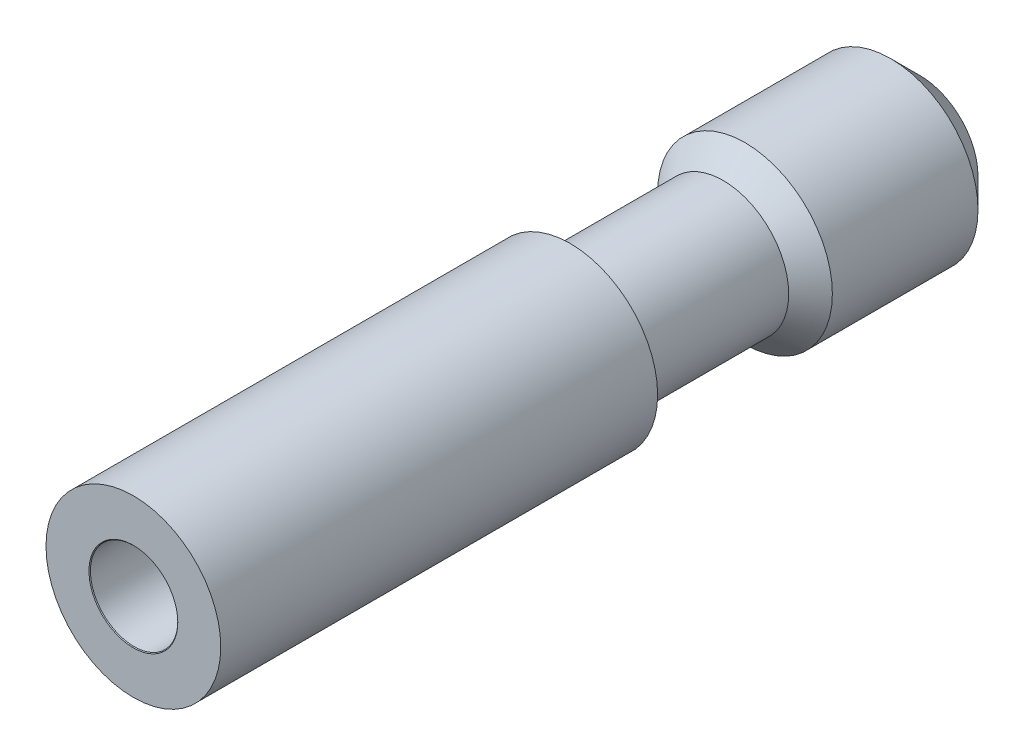
ISO-10303-21;
HEADER;
FILE_DESCRIPTION(('STEP AP214'),'2;1');
FILE_NAME('part.step','',(''),(''),'','','');
FILE_SCHEMA(('AUTOMOTIVE_DESIGN { 1 0 10303 214 1 1 1 1 }'));
ENDSEC;
DATA;
#1=APPLICATION_CONTEXT('core data for automotive mechanical design processes');
#2=APPLICATION_PROTOCOL_DEFINITION('international standard','automotive_design',2000,#1);
#3=PRODUCT_CONTEXT('',#1,'mechanical');
#4=PRODUCT('Part','Part','',(#3));
#5=PRODUCT_RELATED_PRODUCT_CATEGORY('part','',(#4));
#6=PRODUCT_DEFINITION_FORMATION('','',#4);
#7=PRODUCT_DEFINITION_CONTEXT('part definition',#1,'design');
#8=PRODUCT_DEFINITION('design','',#6,#7);
#9=PRODUCT_DEFINITION_SHAPE('','',#8);
#10=(LENGTH_UNIT() NAMED_UNIT(*) SI_UNIT(.MILLI.,.METRE.));
#11=(NAMED_UNIT(*) PLANE_ANGLE_UNIT() SI_UNIT($,.RADIAN.));
#12=(NAMED_UNIT(*) SI_UNIT($,.STERADIAN.) SOLID_ANGLE_UNIT());
#13=UNCERTAINTY_MEASURE_WITH_UNIT(LENGTH_MEASURE(1.E-05),#10,'distance_accuracy_value','');
#14=(GEOMETRIC_REPRESENTATION_CONTEXT(3) GLOBAL_UNCERTAINTY_ASSIGNED_CONTEXT((#13)) GLOBAL_UNIT_ASSIGNED_CONTEXT((#10,
#11,#12)) REPRESENTATION_CONTEXT('',''));
#15=CARTESIAN_POINT('',(0.,0.,0.));
#16=DIRECTION('',(0.,0.,1.));
#17=DIRECTION('',(1.,0.,0.));
#18=AXIS2_PLACEMENT_3D('',#15,#16,#17);
#19=CARTESIAN_POINT('',(0.,0.,27.));
#20=DIRECTION('',(0.,0.,-1.));
#21=DIRECTION('',(-1.,0.,0.));
#22=AXIS2_PLACEMENT_3D('',#19,#20,#21);
#23=CYLINDRICAL_SURFACE('',#22,3.);
#24=CARTESIAN_POINT('',(0.,0.,1.));
#25=DIRECTION('',(0.,0.,1.));
#26=DIRECTION('',(1.,0.,0.));
#27=AXIS2_PLACEMENT_3D('',#24,#25,#26);
#28=CIRCLE('',#27,3.);
#29=CARTESIAN_POINT('',(3.,0.,1.));
#30=VERTEX_POINT('',#29);
#31=EDGE_CURVE('E44',#30,#30,#28,.T.);
#32=ORIENTED_EDGE('',*,*,#31,.T.);
#33=EDGE_LOOP('',(#32));
#34=FACE_BOUND('',#33,.T.);
#35=CARTESIAN_POINT('',(0.,0.,6.));
#36=DIRECTION('',(0.,0.,1.));
#37=DIRECTION('',(1.,0.,0.));
#38=AXIS2_PLACEMENT_3D('',#35,#36,#37);
#39=CIRCLE('',#38,3.);
#40=CARTESIAN_POINT('',(3.,0.,6.));
#41=VERTEX_POINT('',#40);
#42=EDGE_CURVE('E51',#41,#41,#39,.T.);
#43=ORIENTED_EDGE('',*,*,#42,.F.);
#44=EDGE_LOOP('',(#43));
#45=FACE_BOUND('',#44,.T.);
#46=ADVANCED_FACE('F33',(#34,#45),#23,.T.);
#47=CARTESIAN_POINT('',(0.,0.,12.));
#48=DIRECTION('',(0.,0.,1.));
#49=DIRECTION('',(1.,0.,0.));
#50=AXIS2_PLACEMENT_3D('',#47,#48,#49);
#51=CIRCLE('',#50,3.);
#52=CARTESIAN_POINT('',(3.,0.,12.));
#53=VERTEX_POINT('',#52);
#54=EDGE_CURVE('E55',#53,#53,#51,.T.);
#55=ORIENTED_EDGE('',*,*,#54,.T.);
#56=EDGE_LOOP('',(#55));
#57=FACE_BOUND('',#56,.T.);
#58=CARTESIAN_POINT('',(0.,0.,27.));
#59=DIRECTION('',(0.,0.,1.));
#60=DIRECTION('',(1.,0.,0.));
#61=AXIS2_PLACEMENT_3D('',#58,#59,#60);
#62=CIRCLE('',#61,3.);
#63=CARTESIAN_POINT('',(3.,0.,27.));
#64=VERTEX_POINT('',#63);
#65=EDGE_CURVE('E48',#64,#64,#62,.T.);
#66=ORIENTED_EDGE('',*,*,#65,.F.);
#67=EDGE_LOOP('',(#66));
#68=FACE_BOUND('',#67,.T.);
#69=ADVANCED_FACE('F93',(#57,#68),#23,.T.);
#70=CARTESIAN_POINT('',(0.,0.,27.));
#71=DIRECTION('',(0.,0.,1.));
#72=DIRECTION('',(1.,0.,0.));
#73=AXIS2_PLACEMENT_3D('',#70,#71,#72);
#74=PLANE('',#73);
#75=CARTESIAN_POINT('',(0.,0.,27.));
#76=DIRECTION('',(0.,0.,1.));
#77=DIRECTION('',(1.,0.,0.));
#78=AXIS2_PLACEMENT_3D('',#75,#76,#77);
#79=CIRCLE('',#78,1.525);
#80=CARTESIAN_POINT('',(1.525,0.,27.));
#81=VERTEX_POINT('',#80);
#82=EDGE_CURVE('E62',#81,#81,#79,.T.);
#83=ORIENTED_EDGE('',*,*,#82,.F.);
#84=EDGE_LOOP('',(#83));
#85=FACE_BOUND('',#84,.T.);
#86=ORIENTED_EDGE('',*,*,#65,.T.);
#87=EDGE_LOOP('',(#86));
#88=FACE_BOUND('',#87,.T.);
#89=ADVANCED_FACE('F99',(#85,#88),#74,.T.);
#90=CARTESIAN_POINT('',(0.,0.,0.));
#91=DIRECTION('',(0.,0.,1.));
#92=DIRECTION('',(1.,0.,0.));
#93=AXIS2_PLACEMENT_3D('',#90,#91,#92);
#94=PLANE('',#93);
#95=CARTESIAN_POINT('',(0.,0.,0.));
#96=DIRECTION('',(0.,0.,1.));
#97=DIRECTION('',(1.,0.,0.));
#98=AXIS2_PLACEMENT_3D('',#95,#96,#97);
#99=CIRCLE('',#98,1.99999999999999);
#100=CARTESIAN_POINT('',(1.99999999999999,0.,0.));
#101=VERTEX_POINT('',#100);
#102=EDGE_CURVE('E40',#101,#101,#99,.F.);
#103=ORIENTED_EDGE('',*,*,#102,.T.);
#104=EDGE_LOOP('',(#103));
#105=FACE_BOUND('',#104,.T.);
#106=CARTESIAN_POINT('',(0.,0.,0.));
#107=DIRECTION('',(0.,0.,-1.));
#108=DIRECTION('',(-1.,0.,0.));
#109=AXIS2_PLACEMENT_3D('',#106,#107,#108);
#110=CIRCLE('',#109,1.24999999999999);
#111=CARTESIAN_POINT('',(-1.24999999999999,0.,0.));
#112=VERTEX_POINT('',#111);
#113=EDGE_CURVE('E54',#112,#112,#110,.T.);
#114=ORIENTED_EDGE('',*,*,#113,.F.);
#115=EDGE_LOOP('',(#114));
#116=FACE_BOUND('',#115,.T.);
#117=ADVANCED_FACE('F103',(#105,#116),#94,.F.);
#118=CARTESIAN_POINT('',(0.,0.,2.50000000000001));
#119=DIRECTION('',(0.,0.,1.));
#120=DIRECTION('',(1.,0.,0.));
#121=AXIS2_PLACEMENT_3D('',#118,#119,#120);
#122=CONICAL_SURFACE('',#121,1.49999999999999,1.02974425867665);
#123=CARTESIAN_POINT('',(0.,0.,2.34978484524311));
#124=DIRECTION('',(0.,0.,1.));
#125=DIRECTION('',(1.,0.,0.));
#126=AXIS2_PLACEMENT_3D('',#123,#124,#125);
#127=CIRCLE('',#126,1.24999999999999);
#128=CARTESIAN_POINT('',(1.24999999999999,0.,2.34978484524311));
#129=VERTEX_POINT('',#128);
#130=EDGE_CURVE('E59',#129,#129,#127,.F.);
#131=ORIENTED_EDGE('',*,*,#130,.T.);
#132=EDGE_LOOP('',(#131));
#133=FACE_BOUND('',#132,.T.);
#134=CARTESIAN_POINT('',(0.,0.,2.50000000000001));
#135=DIRECTION('',(0.,0.,1.));
#136=DIRECTION('',(1.,0.,0.));
#137=AXIS2_PLACEMENT_3D('',#134,#135,#136);
#138=CIRCLE('',#137,1.49999999999999);
#139=CARTESIAN_POINT('',(1.49999999999999,0.,2.50000000000001));
#140=VERTEX_POINT('',#139);
#141=EDGE_CURVE('E65',#140,#140,#138,.T.);
#142=ORIENTED_EDGE('',*,*,#141,.T.);
#143=EDGE_LOOP('',(#142));
#144=FACE_BOUND('',#143,.T.);
#145=ADVANCED_FACE('F106',(#133,#144),#122,.F.);
#146=CARTESIAN_POINT('',(0.,0.,27.));
#147=DIRECTION('',(0.,0.,1.));
#148=DIRECTION('',(1.,0.,0.));
#149=AXIS2_PLACEMENT_3D('',#146,#147,#148);
#150=CYLINDRICAL_SURFACE('',#149,1.49999999999999);
#151=ORIENTED_EDGE('',*,*,#141,.F.);
#152=EDGE_LOOP('',(#151));
#153=FACE_BOUND('',#152,.T.);
#154=CARTESIAN_POINT('',(0.,0.,26.975));
#155=DIRECTION('',(0.,0.,1.));
#156=DIRECTION('',(1.,0.,0.));
#157=AXIS2_PLACEMENT_3D('',#154,#155,#156);
#158=CIRCLE('',#157,1.5);
#159=CARTESIAN_POINT('',(1.5,0.,26.975));
#160=VERTEX_POINT('',#159);
#161=EDGE_CURVE('E68',#160,#160,#158,.T.);
#162=ORIENTED_EDGE('',*,*,#161,.T.);
#163=EDGE_LOOP('',(#162));
#164=FACE_BOUND('',#163,.T.);
#165=ADVANCED_FACE('F112',(#153,#164),#150,.F.);
#166=CARTESIAN_POINT('',(0.,0.,27.));
#167=DIRECTION('',(0.,0.,1.));
#168=DIRECTION('',(1.,0.,0.));
#169=AXIS2_PLACEMENT_3D('',#166,#167,#168);
#170=CONICAL_SURFACE('',#169,1.525,0.785398163397431);
#171=ORIENTED_EDGE('',*,*,#161,.F.);
#172=EDGE_LOOP('',(#171));
#173=FACE_BOUND('',#172,.T.);
#174=ORIENTED_EDGE('',*,*,#82,.T.);
#175=EDGE_LOOP('',(#174));
#176=FACE_BOUND('',#175,.T.);
#177=ADVANCED_FACE('F116',(#173,#176),#170,.F.);
#178=CARTESIAN_POINT('',(0.,0.,0.));
#179=DIRECTION('',(0.,0.,-1.));
#180=DIRECTION('',(-1.,0.,0.));
#181=AXIS2_PLACEMENT_3D('',#178,#179,#180);
#182=CYLINDRICAL_SURFACE('',#181,1.24999999999999);
#183=ORIENTED_EDGE('',*,*,#113,.T.);
#184=EDGE_LOOP('',(#183));
#185=FACE_BOUND('',#184,.T.);
#186=ORIENTED_EDGE('',*,*,#130,.F.);
#187=EDGE_LOOP('',(#186));
#188=FACE_BOUND('',#187,.T.);
#189=ADVANCED_FACE('F90',(#185,#188),#182,.F.);
#190=CARTESIAN_POINT('',(0.,0.,12.));
#191=DIRECTION('',(0.,0.,1.));
#192=DIRECTION('',(1.,0.,0.));
#193=AXIS2_PLACEMENT_3D('',#190,#191,#192);
#194=PLANE('',#193);
#195=CARTESIAN_POINT('',(0.,0.,12.));
#196=DIRECTION('',(0.,0.,1.));
#197=DIRECTION('',(1.,0.,0.));
#198=AXIS2_PLACEMENT_3D('',#195,#196,#197);
#199=CIRCLE('',#198,2.25);
#200=CARTESIAN_POINT('',(2.25,0.,12.));
#201=VERTEX_POINT('',#200);
#202=EDGE_CURVE('E58',#201,#201,#199,.T.);
#203=ORIENTED_EDGE('',*,*,#202,.T.);
#204=EDGE_LOOP('',(#203));
#205=FACE_BOUND('',#204,.T.);
#206=ORIENTED_EDGE('',*,*,#54,.F.);
#207=EDGE_LOOP('',(#206));
#208=FACE_BOUND('',#207,.T.);
#209=ADVANCED_FACE('F78',(#205,#208),#194,.F.);
#210=CARTESIAN_POINT('',(0.,0.,6.));
#211=DIRECTION('',(0.,0.,1.));
#212=DIRECTION('',(1.,0.,0.));
#213=AXIS2_PLACEMENT_3D('',#210,#211,#212);
#214=CYLINDRICAL_SURFACE('',#213,2.25);
#215=CARTESIAN_POINT('',(0.,0.,6.75));
#216=DIRECTION('',(0.,0.,1.));
#217=DIRECTION('',(1.,0.,0.));
#218=AXIS2_PLACEMENT_3D('',#215,#216,#217);
#219=CIRCLE('',#218,2.25);
#220=CARTESIAN_POINT('',(2.25,0.,6.75));
#221=VERTEX_POINT('',#220);
#222=EDGE_CURVE('E10',#221,#221,#219,.T.);
#223=ORIENTED_EDGE('',*,*,#222,.T.);
#224=EDGE_LOOP('',(#223));
#225=FACE_BOUND('',#224,.T.);
#226=ORIENTED_EDGE('',*,*,#202,.F.);
#227=EDGE_LOOP('',(#226));
#228=FACE_BOUND('',#227,.T.);
#229=ADVANCED_FACE('F81',(#225,#228),#214,.T.);
#230=CARTESIAN_POINT('',(0.,0.,1.));
#231=DIRECTION('',(0.,0.,1.));
#232=DIRECTION('',(1.,0.,0.));
#233=AXIS2_PLACEMENT_3D('',#230,#231,#232);
#234=CONICAL_SURFACE('',#233,3.,0.78539816339745);
#235=ORIENTED_EDGE('',*,*,#102,.F.);
#236=EDGE_LOOP('',(#235));
#237=FACE_BOUND('',#236,.T.);
#238=ORIENTED_EDGE('',*,*,#31,.F.);
#239=EDGE_LOOP('',(#238));
#240=FACE_BOUND('',#239,.T.);
#241=ADVANCED_FACE('F83',(#237,#240),#234,.T.);
#242=CARTESIAN_POINT('',(0.,0.,6.75));
#243=DIRECTION('',(0.,0.,-1.));
#244=DIRECTION('',(-1.,0.,0.));
#245=AXIS2_PLACEMENT_3D('',#242,#243,#244);
#246=CONICAL_SURFACE('',#245,2.25,0.785398163397445);
#247=ORIENTED_EDGE('',*,*,#42,.T.);
#248=EDGE_LOOP('',(#247));
#249=FACE_BOUND('',#248,.T.);
#250=ORIENTED_EDGE('',*,*,#222,.F.);
#251=EDGE_LOOP('',(#250));
#252=FACE_BOUND('',#251,.T.);
#253=ADVANCED_FACE('F35',(#249,#252),#246,.T.);
#254=CLOSED_SHELL('',(#46,#69,#89,#117,#145,#165,#177,#189,#209,#229,#241,#253));
#255=MANIFOLD_SOLID_BREP('B2',#254);
#256=ADVANCED_BREP_SHAPE_REPRESENTATION('',(#18,#255),#14);
#257=SHAPE_DEFINITION_REPRESENTATION(#9,#256);
ENDSEC;
END-ISO-10303-21;
